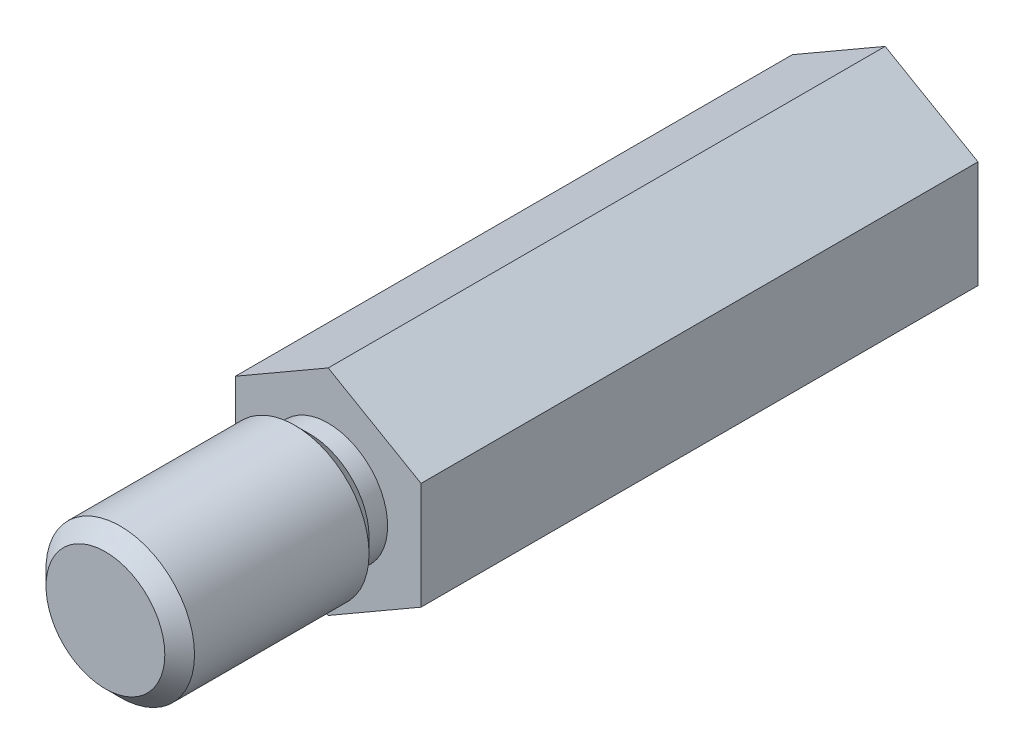
ISO-10303-21;
HEADER;
FILE_DESCRIPTION(('STEP AP214'),'2;1');
FILE_NAME('part.step','',(''),(''),'','','');
FILE_SCHEMA(('AUTOMOTIVE_DESIGN { 1 0 10303 214 1 1 1 1 }'));
ENDSEC;
DATA;
#1=APPLICATION_CONTEXT('core data for automotive mechanical design processes');
#2=APPLICATION_PROTOCOL_DEFINITION('international standard','automotive_design',2000,#1);
#3=PRODUCT_CONTEXT('',#1,'mechanical');
#4=PRODUCT('Part','Part','',(#3));
#5=PRODUCT_RELATED_PRODUCT_CATEGORY('part','',(#4));
#6=PRODUCT_DEFINITION_FORMATION('','',#4);
#7=PRODUCT_DEFINITION_CONTEXT('part definition',#1,'design');
#8=PRODUCT_DEFINITION('design','',#6,#7);
#9=PRODUCT_DEFINITION_SHAPE('','',#8);
#10=(LENGTH_UNIT() NAMED_UNIT(*) SI_UNIT(.MILLI.,.METRE.));
#11=(NAMED_UNIT(*) PLANE_ANGLE_UNIT() SI_UNIT($,.RADIAN.));
#12=(NAMED_UNIT(*) SI_UNIT($,.STERADIAN.) SOLID_ANGLE_UNIT());
#13=UNCERTAINTY_MEASURE_WITH_UNIT(LENGTH_MEASURE(1.E-05),#10,'distance_accuracy_value','');
#14=(GEOMETRIC_REPRESENTATION_CONTEXT(3) GLOBAL_UNCERTAINTY_ASSIGNED_CONTEXT((#13)) GLOBAL_UNIT_ASSIGNED_CONTEXT((#10,
#11,#12)) REPRESENTATION_CONTEXT('',''));
#15=CARTESIAN_POINT('',(0.,0.,0.));
#16=DIRECTION('',(0.,0.,1.));
#17=DIRECTION('',(1.,0.,0.));
#18=AXIS2_PLACEMENT_3D('',#15,#16,#17);
#19=CARTESIAN_POINT('',(0.,2.88675134594813,15.));
#20=DIRECTION('',(0.,0.,1.));
#21=DIRECTION('',(1.,0.,0.));
#22=AXIS2_PLACEMENT_3D('',#19,#20,#21);
#23=PLANE('',#22);
#24=DIRECTION('',(-0.866025403784439,0.5,0.));
#25=VECTOR('',#24,1.);
#26=CARTESIAN_POINT('',(2.5,1.44337567297407,15.));
#27=LINE('',#26,#25);
#28=CARTESIAN_POINT('',(2.5,1.44337567297407,15.));
#29=VERTEX_POINT('',#28);
#30=CARTESIAN_POINT('',(0.,2.88675134594813,15.));
#31=VERTEX_POINT('',#30);
#32=EDGE_CURVE('E127',#29,#31,#27,.T.);
#33=ORIENTED_EDGE('',*,*,#32,.T.);
#34=DIRECTION('',(-0.866025403784438,-0.5,0.));
#35=VECTOR('',#34,1.);
#36=CARTESIAN_POINT('',(0.,2.88675134594813,15.));
#37=LINE('',#36,#35);
#38=CARTESIAN_POINT('',(-2.5,1.44337567297407,15.));
#39=VERTEX_POINT('',#38);
#40=EDGE_CURVE('E85',#31,#39,#37,.T.);
#41=ORIENTED_EDGE('',*,*,#40,.T.);
#42=DIRECTION('',(0.,-1.,0.));
#43=VECTOR('',#42,1.);
#44=CARTESIAN_POINT('',(-2.5,1.44337567297407,15.));
#45=LINE('',#44,#43);
#46=CARTESIAN_POINT('',(-2.5,-1.44337567297406,15.));
#47=VERTEX_POINT('',#46);
#48=EDGE_CURVE('E98',#39,#47,#45,.T.);
#49=ORIENTED_EDGE('',*,*,#48,.T.);
#50=DIRECTION('',(0.866025403784439,-0.5,0.));
#51=VECTOR('',#50,1.);
#52=CARTESIAN_POINT('',(-2.5,-1.44337567297406,15.));
#53=LINE('',#52,#51);
#54=CARTESIAN_POINT('',(0.,-2.88675134594813,15.));
#55=VERTEX_POINT('',#54);
#56=EDGE_CURVE('E92',#47,#55,#53,.T.);
#57=ORIENTED_EDGE('',*,*,#56,.T.);
#58=DIRECTION('',(0.866025403784439,0.5,0.));
#59=VECTOR('',#58,1.);
#60=CARTESIAN_POINT('',(0.,-2.88675134594813,15.));
#61=LINE('',#60,#59);
#62=CARTESIAN_POINT('',(2.5,-1.44337567297407,15.));
#63=VERTEX_POINT('',#62);
#64=EDGE_CURVE('E96',#55,#63,#61,.T.);
#65=ORIENTED_EDGE('',*,*,#64,.T.);
#66=DIRECTION('',(0.,1.,0.));
#67=VECTOR('',#66,1.);
#68=CARTESIAN_POINT('',(2.5,-1.44337567297407,15.));
#69=LINE('',#68,#67);
#70=EDGE_CURVE('E47',#63,#29,#69,.T.);
#71=ORIENTED_EDGE('',*,*,#70,.T.);
#72=EDGE_LOOP('',(#33,#41,#49,#57,#65,#71));
#73=FACE_BOUND('',#72,.T.);
#74=CARTESIAN_POINT('',(0.,0.,15.));
#75=DIRECTION('',(0.,0.,1.));
#76=DIRECTION('',(1.,0.,0.));
#77=AXIS2_PLACEMENT_3D('',#74,#75,#76);
#78=CIRCLE('',#77,1.6);
#79=CARTESIAN_POINT('',(1.6,0.,15.));
#80=VERTEX_POINT('',#79);
#81=EDGE_CURVE('E192',#80,#80,#78,.T.);
#82=ORIENTED_EDGE('',*,*,#81,.F.);
#83=EDGE_LOOP('',(#82));
#84=FACE_BOUND('',#83,.T.);
#85=ADVANCED_FACE('F30',(#73,#84),#23,.T.);
#86=CARTESIAN_POINT('',(2.5,1.44337567297407,15.));
#87=DIRECTION('',(-0.5,-0.866025403784439,0.));
#88=DIRECTION('',(0.866025403784439,-0.5,0.));
#89=AXIS2_PLACEMENT_3D('',#86,#87,#88);
#90=PLANE('',#89);
#91=DIRECTION('',(-0.866025403784439,0.5,0.));
#92=VECTOR('',#91,1.);
#93=CARTESIAN_POINT('',(2.5,1.44337567297407,0.));
#94=LINE('',#93,#92);
#95=CARTESIAN_POINT('',(2.5,1.44337567297407,0.));
#96=VERTEX_POINT('',#95);
#97=CARTESIAN_POINT('',(0.,2.88675134594813,0.));
#98=VERTEX_POINT('',#97);
#99=EDGE_CURVE('E116',#96,#98,#94,.T.);
#100=ORIENTED_EDGE('',*,*,#99,.T.);
#101=DIRECTION('',(0.,0.,-1.));
#102=VECTOR('',#101,1.);
#103=CARTESIAN_POINT('',(0.,2.88675134594813,15.));
#104=LINE('',#103,#102);
#105=EDGE_CURVE('E134',#31,#98,#104,.T.);
#106=ORIENTED_EDGE('',*,*,#105,.F.);
#107=ORIENTED_EDGE('',*,*,#32,.F.);
#108=DIRECTION('',(0.,0.,-1.));
#109=VECTOR('',#108,1.);
#110=CARTESIAN_POINT('',(2.5,1.44337567297407,15.));
#111=LINE('',#110,#109);
#112=EDGE_CURVE('E112',#29,#96,#111,.T.);
#113=ORIENTED_EDGE('',*,*,#112,.T.);
#114=EDGE_LOOP('',(#100,#106,#107,#113));
#115=FACE_BOUND('',#114,.T.);
#116=ADVANCED_FACE('F157',(#115),#90,.F.);
#117=CARTESIAN_POINT('',(0.,2.88675134594813,15.));
#118=DIRECTION('',(0.5,-0.866025403784438,0.));
#119=DIRECTION('',(0.866025403784439,0.5,0.));
#120=AXIS2_PLACEMENT_3D('',#117,#118,#119);
#121=PLANE('',#120);
#122=DIRECTION('',(-0.866025403784438,-0.5,0.));
#123=VECTOR('',#122,1.);
#124=CARTESIAN_POINT('',(0.,2.88675134594813,0.));
#125=LINE('',#124,#123);
#126=CARTESIAN_POINT('',(-2.5,1.44337567297407,0.));
#127=VERTEX_POINT('',#126);
#128=EDGE_CURVE('E119',#98,#127,#125,.T.);
#129=ORIENTED_EDGE('',*,*,#128,.T.);
#130=DIRECTION('',(0.,0.,-1.));
#131=VECTOR('',#130,1.);
#132=CARTESIAN_POINT('',(-2.5,1.44337567297407,15.));
#133=LINE('',#132,#131);
#134=EDGE_CURVE('E131',#39,#127,#133,.T.);
#135=ORIENTED_EDGE('',*,*,#134,.F.);
#136=ORIENTED_EDGE('',*,*,#40,.F.);
#137=ORIENTED_EDGE('',*,*,#105,.T.);
#138=EDGE_LOOP('',(#129,#135,#136,#137));
#139=FACE_BOUND('',#138,.T.);
#140=ADVANCED_FACE('F162',(#139),#121,.F.);
#141=CARTESIAN_POINT('',(-2.5,1.44337567297407,15.));
#142=DIRECTION('',(1.,0.,0.));
#143=DIRECTION('',(0.,0.,-1.));
#144=AXIS2_PLACEMENT_3D('',#141,#142,#143);
#145=PLANE('',#144);
#146=DIRECTION('',(0.,-1.,0.));
#147=VECTOR('',#146,1.);
#148=CARTESIAN_POINT('',(-2.5,1.44337567297407,0.));
#149=LINE('',#148,#147);
#150=CARTESIAN_POINT('',(-2.5,-1.44337567297406,0.));
#151=VERTEX_POINT('',#150);
#152=EDGE_CURVE('E122',#127,#151,#149,.T.);
#153=ORIENTED_EDGE('',*,*,#152,.T.);
#154=DIRECTION('',(0.,0.,-1.));
#155=VECTOR('',#154,1.);
#156=CARTESIAN_POINT('',(-2.5,-1.44337567297406,15.));
#157=LINE('',#156,#155);
#158=EDGE_CURVE('E107',#47,#151,#157,.T.);
#159=ORIENTED_EDGE('',*,*,#158,.F.);
#160=ORIENTED_EDGE('',*,*,#48,.F.);
#161=ORIENTED_EDGE('',*,*,#134,.T.);
#162=EDGE_LOOP('',(#153,#159,#160,#161));
#163=FACE_BOUND('',#162,.T.);
#164=ADVANCED_FACE('F178',(#163),#145,.F.);
#165=CARTESIAN_POINT('',(-2.5,-1.44337567297406,15.));
#166=DIRECTION('',(0.5,0.866025403784439,0.));
#167=DIRECTION('',(-0.866025403784439,0.5,0.));
#168=AXIS2_PLACEMENT_3D('',#165,#166,#167);
#169=PLANE('',#168);
#170=DIRECTION('',(0.866025403784439,-0.5,0.));
#171=VECTOR('',#170,1.);
#172=CARTESIAN_POINT('',(-2.5,-1.44337567297406,0.));
#173=LINE('',#172,#171);
#174=CARTESIAN_POINT('',(0.,-2.88675134594813,0.));
#175=VERTEX_POINT('',#174);
#176=EDGE_CURVE('E106',#151,#175,#173,.T.);
#177=ORIENTED_EDGE('',*,*,#176,.T.);
#178=DIRECTION('',(0.,0.,-1.));
#179=VECTOR('',#178,1.);
#180=CARTESIAN_POINT('',(0.,-2.88675134594813,15.));
#181=LINE('',#180,#179);
#182=EDGE_CURVE('E103',#55,#175,#181,.T.);
#183=ORIENTED_EDGE('',*,*,#182,.F.);
#184=ORIENTED_EDGE('',*,*,#56,.F.);
#185=ORIENTED_EDGE('',*,*,#158,.T.);
#186=EDGE_LOOP('',(#177,#183,#184,#185));
#187=FACE_BOUND('',#186,.T.);
#188=ADVANCED_FACE('F104',(#187),#169,.F.);
#189=CARTESIAN_POINT('',(0.,-2.88675134594813,15.));
#190=DIRECTION('',(-0.5,0.866025403784439,0.));
#191=DIRECTION('',(-0.866025403784439,-0.5,0.));
#192=AXIS2_PLACEMENT_3D('',#189,#190,#191);
#193=PLANE('',#192);
#194=DIRECTION('',(0.866025403784439,0.5,0.));
#195=VECTOR('',#194,1.);
#196=CARTESIAN_POINT('',(0.,-2.88675134594813,0.));
#197=LINE('',#196,#195);
#198=CARTESIAN_POINT('',(2.5,-1.44337567297407,0.));
#199=VERTEX_POINT('',#198);
#200=EDGE_CURVE('E70',#175,#199,#197,.T.);
#201=ORIENTED_EDGE('',*,*,#200,.T.);
#202=DIRECTION('',(0.,0.,-1.));
#203=VECTOR('',#202,1.);
#204=CARTESIAN_POINT('',(2.5,-1.44337567297407,15.));
#205=LINE('',#204,#203);
#206=EDGE_CURVE('E108',#63,#199,#205,.T.);
#207=ORIENTED_EDGE('',*,*,#206,.F.);
#208=ORIENTED_EDGE('',*,*,#64,.F.);
#209=ORIENTED_EDGE('',*,*,#182,.T.);
#210=EDGE_LOOP('',(#201,#207,#208,#209));
#211=FACE_BOUND('',#210,.T.);
#212=ADVANCED_FACE('F110',(#211),#193,.F.);
#213=CARTESIAN_POINT('',(2.5,-1.44337567297407,15.));
#214=DIRECTION('',(-1.,0.,0.));
#215=DIRECTION('',(0.,0.,1.));
#216=AXIS2_PLACEMENT_3D('',#213,#214,#215);
#217=PLANE('',#216);
#218=DIRECTION('',(0.,1.,0.));
#219=VECTOR('',#218,1.);
#220=CARTESIAN_POINT('',(2.5,-1.44337567297407,0.));
#221=LINE('',#220,#219);
#222=EDGE_CURVE('E76',#199,#96,#221,.T.);
#223=ORIENTED_EDGE('',*,*,#222,.T.);
#224=ORIENTED_EDGE('',*,*,#112,.F.);
#225=ORIENTED_EDGE('',*,*,#70,.F.);
#226=ORIENTED_EDGE('',*,*,#206,.T.);
#227=EDGE_LOOP('',(#223,#224,#225,#226));
#228=FACE_BOUND('',#227,.T.);
#229=ADVANCED_FACE('F170',(#228),#217,.F.);
#230=CARTESIAN_POINT('',(0.,2.88675134594813,0.));
#231=DIRECTION('',(0.,0.,1.));
#232=DIRECTION('',(1.,0.,0.));
#233=AXIS2_PLACEMENT_3D('',#230,#231,#232);
#234=PLANE('',#233);
#235=ORIENTED_EDGE('',*,*,#99,.F.);
#236=ORIENTED_EDGE('',*,*,#222,.F.);
#237=ORIENTED_EDGE('',*,*,#200,.F.);
#238=ORIENTED_EDGE('',*,*,#176,.F.);
#239=ORIENTED_EDGE('',*,*,#152,.F.);
#240=ORIENTED_EDGE('',*,*,#128,.F.);
#241=EDGE_LOOP('',(#235,#236,#237,#238,#239,#240));
#242=FACE_BOUND('',#241,.T.);
#243=ADVANCED_FACE('F166',(#242),#234,.F.);
#244=CARTESIAN_POINT('',(0.,0.,15.5));
#245=DIRECTION('',(0.,0.,-1.));
#246=DIRECTION('',(-1.,0.,0.));
#247=AXIS2_PLACEMENT_3D('',#244,#245,#246);
#248=CYLINDRICAL_SURFACE('',#247,1.6);
#249=CARTESIAN_POINT('',(0.,0.,15.5));
#250=DIRECTION('',(0.,0.,1.));
#251=DIRECTION('',(1.,0.,0.));
#252=AXIS2_PLACEMENT_3D('',#249,#250,#251);
#253=CIRCLE('',#252,1.6);
#254=CARTESIAN_POINT('',(1.6,0.,15.5));
#255=VERTEX_POINT('',#254);
#256=EDGE_CURVE('E120',#255,#255,#253,.T.);
#257=ORIENTED_EDGE('',*,*,#256,.F.);
#258=EDGE_LOOP('',(#257));
#259=FACE_BOUND('',#258,.T.);
#260=ORIENTED_EDGE('',*,*,#81,.T.);
#261=EDGE_LOOP('',(#260));
#262=FACE_BOUND('',#261,.T.);
#263=ADVANCED_FACE('F169',(#259,#262),#248,.T.);
#264=CARTESIAN_POINT('',(0.,0.,21.));
#265=DIRECTION('',(0.,0.,1.));
#266=DIRECTION('',(1.,0.,0.));
#267=AXIS2_PLACEMENT_3D('',#264,#265,#266);
#268=PLANE('',#267);
#269=CARTESIAN_POINT('',(0.,0.,21.));
#270=DIRECTION('',(0.,0.,1.));
#271=DIRECTION('',(1.,0.,0.));
#272=AXIS2_PLACEMENT_3D('',#269,#270,#271);
#273=CIRCLE('',#272,1.6);
#274=CARTESIAN_POINT('',(1.6,0.,21.));
#275=VERTEX_POINT('',#274);
#276=EDGE_CURVE('E11',#275,#275,#273,.T.);
#277=ORIENTED_EDGE('',*,*,#276,.T.);
#278=EDGE_LOOP('',(#277));
#279=FACE_BOUND('',#278,.T.);
#280=ADVANCED_FACE('F152',(#279),#268,.T.);
#281=CARTESIAN_POINT('',(0.,0.,21.));
#282=DIRECTION('',(0.,0.,-1.));
#283=DIRECTION('',(-1.,0.,0.));
#284=AXIS2_PLACEMENT_3D('',#281,#282,#283);
#285=CYLINDRICAL_SURFACE('',#284,2.);
#286=CARTESIAN_POINT('',(0.,0.,15.9));
#287=DIRECTION('',(0.,0.,1.));
#288=DIRECTION('',(1.,0.,0.));
#289=AXIS2_PLACEMENT_3D('',#286,#287,#288);
#290=CIRCLE('',#289,2.);
#291=CARTESIAN_POINT('',(2.,0.,15.9));
#292=VERTEX_POINT('',#291);
#293=EDGE_CURVE('E39',#292,#292,#290,.T.);
#294=ORIENTED_EDGE('',*,*,#293,.T.);
#295=EDGE_LOOP('',(#294));
#296=FACE_BOUND('',#295,.T.);
#297=CARTESIAN_POINT('',(0.,0.,20.6));
#298=DIRECTION('',(0.,0.,1.));
#299=DIRECTION('',(1.,0.,0.));
#300=AXIS2_PLACEMENT_3D('',#297,#298,#299);
#301=CIRCLE('',#300,2.);
#302=CARTESIAN_POINT('',(2.,0.,20.6));
#303=VERTEX_POINT('',#302);
#304=EDGE_CURVE('E136',#303,#303,#301,.F.);
#305=ORIENTED_EDGE('',*,*,#304,.T.);
#306=EDGE_LOOP('',(#305));
#307=FACE_BOUND('',#306,.T.);
#308=ADVANCED_FACE('F141',(#296,#307),#285,.T.);
#309=CARTESIAN_POINT('',(0.,0.,15.9));
#310=DIRECTION('',(0.,0.,1.));
#311=DIRECTION('',(1.,0.,0.));
#312=AXIS2_PLACEMENT_3D('',#309,#310,#311);
#313=CONICAL_SURFACE('',#312,2.,0.785398163397453);
#314=ORIENTED_EDGE('',*,*,#256,.T.);
#315=EDGE_LOOP('',(#314));
#316=FACE_BOUND('',#315,.T.);
#317=ORIENTED_EDGE('',*,*,#293,.F.);
#318=EDGE_LOOP('',(#317));
#319=FACE_BOUND('',#318,.T.);
#320=ADVANCED_FACE('F144',(#316,#319),#313,.T.);
#321=CARTESIAN_POINT('',(0.,0.,21.));
#322=DIRECTION('',(0.,0.,-1.));
#323=DIRECTION('',(-1.,0.,0.));
#324=AXIS2_PLACEMENT_3D('',#321,#322,#323);
#325=CONICAL_SURFACE('',#324,1.6,0.785398163397449);
#326=ORIENTED_EDGE('',*,*,#304,.F.);
#327=EDGE_LOOP('',(#326));
#328=FACE_BOUND('',#327,.T.);
#329=ORIENTED_EDGE('',*,*,#276,.F.);
#330=EDGE_LOOP('',(#329));
#331=FACE_BOUND('',#330,.T.);
#332=ADVANCED_FACE('F32',(#328,#331),#325,.T.);
#333=CLOSED_SHELL('',(#85,#116,#140,#164,#188,#212,#229,#243,#263,#280,#308,#320,#332));
#334=MANIFOLD_SOLID_BREP('B2',#333);
#335=ADVANCED_BREP_SHAPE_REPRESENTATION('',(#18,#334),#14);
#336=SHAPE_DEFINITION_REPRESENTATION(#9,#335);
ENDSEC;
END-ISO-10303-21;
